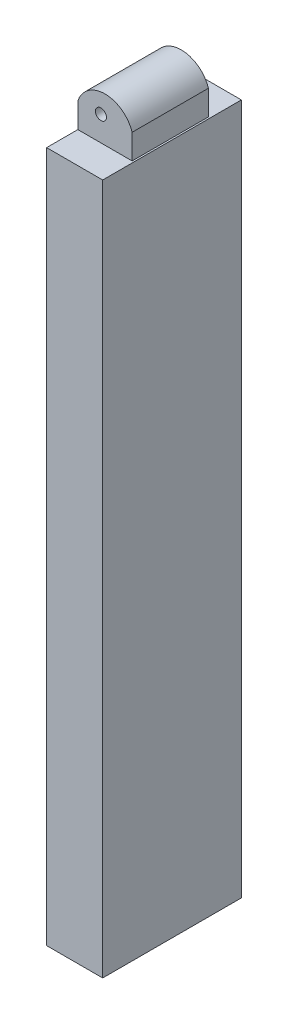
ISO-10303-21;
HEADER;
FILE_DESCRIPTION(('STEP AP214'),'2;1');
FILE_NAME('part.step','',(''),(''),'','','');
FILE_SCHEMA(('AUTOMOTIVE_DESIGN { 1 0 10303 214 1 1 1 1 }'));
ENDSEC;
DATA;
#1=APPLICATION_CONTEXT('core data for automotive mechanical design processes');
#2=APPLICATION_PROTOCOL_DEFINITION('international standard','automotive_design',2000,#1);
#3=PRODUCT_CONTEXT('',#1,'mechanical');
#4=PRODUCT('Part','Part','',(#3));
#5=PRODUCT_RELATED_PRODUCT_CATEGORY('part','',(#4));
#6=PRODUCT_DEFINITION_FORMATION('','',#4);
#7=PRODUCT_DEFINITION_CONTEXT('part definition',#1,'design');
#8=PRODUCT_DEFINITION('design','',#6,#7);
#9=PRODUCT_DEFINITION_SHAPE('','',#8);
#10=(LENGTH_UNIT() NAMED_UNIT(*) SI_UNIT(.MILLI.,.METRE.));
#11=(NAMED_UNIT(*) PLANE_ANGLE_UNIT() SI_UNIT($,.RADIAN.));
#12=(NAMED_UNIT(*) SI_UNIT($,.STERADIAN.) SOLID_ANGLE_UNIT());
#13=UNCERTAINTY_MEASURE_WITH_UNIT(LENGTH_MEASURE(1.E-05),#10,'distance_accuracy_value','');
#14=(GEOMETRIC_REPRESENTATION_CONTEXT(3) GLOBAL_UNCERTAINTY_ASSIGNED_CONTEXT((#13)) GLOBAL_UNIT_ASSIGNED_CONTEXT((#10,
#11,#12)) REPRESENTATION_CONTEXT('',''));
#15=CARTESIAN_POINT('',(0.,0.,0.));
#16=DIRECTION('',(0.,0.,1.));
#17=DIRECTION('',(1.,0.,0.));
#18=AXIS2_PLACEMENT_3D('',#15,#16,#17);
#19=CARTESIAN_POINT('',(9.4,67.8,-6.6));
#20=DIRECTION('',(0.,0.,1.));
#21=DIRECTION('',(1.,0.,0.));
#22=AXIS2_PLACEMENT_3D('',#19,#20,#21);
#23=PLANE('',#22);
#24=DIRECTION('',(0.,-1.,0.));
#25=VECTOR('',#24,1.);
#26=CARTESIAN_POINT('',(0.,67.8,-6.6));
#27=LINE('',#26,#25);
#28=CARTESIAN_POINT('',(0.,64.1,-6.6));
#29=VERTEX_POINT('',#28);
#30=CARTESIAN_POINT('',(0.,59.8,-6.6));
#31=VERTEX_POINT('',#30);
#32=EDGE_CURVE('E139',#29,#31,#27,.T.);
#33=ORIENTED_EDGE('',*,*,#32,.F.);
#34=CARTESIAN_POINT('',(4.7,62.5514705882353,-6.6));
#35=DIRECTION('',(0.,0.,1.));
#36=DIRECTION('',(1.,0.,0.));
#37=AXIS2_PLACEMENT_3D('',#34,#35,#36);
#38=CIRCLE('',#37,4.9485294117647);
#39=CARTESIAN_POINT('',(9.4,64.1,-6.6));
#40=VERTEX_POINT('',#39);
#41=EDGE_CURVE('E130',#29,#40,#38,.F.);
#42=ORIENTED_EDGE('',*,*,#41,.T.);
#43=DIRECTION('',(0.,-1.,0.));
#44=VECTOR('',#43,1.);
#45=CARTESIAN_POINT('',(9.4,67.8,-6.6));
#46=LINE('',#45,#44);
#47=CARTESIAN_POINT('',(9.4,59.8,-6.6));
#48=VERTEX_POINT('',#47);
#49=EDGE_CURVE('E129',#40,#48,#46,.T.);
#50=ORIENTED_EDGE('',*,*,#49,.T.);
#51=DIRECTION('',(-1.,0.,0.));
#52=VECTOR('',#51,1.);
#53=CARTESIAN_POINT('',(9.4,59.8,-6.6));
#54=LINE('',#53,#52);
#55=EDGE_CURVE('E141',#48,#31,#54,.T.);
#56=ORIENTED_EDGE('',*,*,#55,.T.);
#57=EDGE_LOOP('',(#33,#42,#50,#56));
#58=FACE_BOUND('',#57,.T.);
#59=CARTESIAN_POINT('',(4.,64.1,-6.6));
#60=DIRECTION('',(0.,0.,1.));
#61=DIRECTION('',(1.,0.,0.));
#62=AXIS2_PLACEMENT_3D('',#59,#60,#61);
#63=CIRCLE('',#62,0.949999999999999);
#64=CARTESIAN_POINT('',(4.95,64.1,-6.6));
#65=VERTEX_POINT('',#64);
#66=EDGE_CURVE('E232',#65,#65,#63,.T.);
#67=ORIENTED_EDGE('',*,*,#66,.T.);
#68=EDGE_LOOP('',(#67));
#69=FACE_BOUND('',#68,.T.);
#70=ADVANCED_FACE('F54',(#58,#69),#23,.F.);
#71=CARTESIAN_POINT('',(9.4,67.8,6.6));
#72=DIRECTION('',(0.,0.,-1.));
#73=DIRECTION('',(-1.,0.,0.));
#74=AXIS2_PLACEMENT_3D('',#71,#72,#73);
#75=PLANE('',#74);
#76=DIRECTION('',(0.,-1.,0.));
#77=VECTOR('',#76,1.);
#78=CARTESIAN_POINT('',(9.4,67.8,6.6));
#79=LINE('',#78,#77);
#80=CARTESIAN_POINT('',(9.4,64.1,6.6));
#81=VERTEX_POINT('',#80);
#82=CARTESIAN_POINT('',(9.4,59.8,6.6));
#83=VERTEX_POINT('',#82);
#84=EDGE_CURVE('E79',#81,#83,#79,.T.);
#85=ORIENTED_EDGE('',*,*,#84,.F.);
#86=CARTESIAN_POINT('',(4.7,62.5514705882353,6.6));
#87=DIRECTION('',(0.,0.,1.));
#88=DIRECTION('',(1.,0.,0.));
#89=AXIS2_PLACEMENT_3D('',#86,#87,#88);
#90=CIRCLE('',#89,4.9485294117647);
#91=CARTESIAN_POINT('',(0.,64.1,6.6));
#92=VERTEX_POINT('',#91);
#93=EDGE_CURVE('E119',#92,#81,#90,.F.);
#94=ORIENTED_EDGE('',*,*,#93,.F.);
#95=DIRECTION('',(0.,-1.,0.));
#96=VECTOR('',#95,1.);
#97=CARTESIAN_POINT('',(0.,67.8,6.6));
#98=LINE('',#97,#96);
#99=CARTESIAN_POINT('',(0.,59.8,6.6));
#100=VERTEX_POINT('',#99);
#101=EDGE_CURVE('E137',#92,#100,#98,.T.);
#102=ORIENTED_EDGE('',*,*,#101,.T.);
#103=DIRECTION('',(1.,0.,0.));
#104=VECTOR('',#103,1.);
#105=CARTESIAN_POINT('',(9.4,59.8,6.6));
#106=LINE('',#105,#104);
#107=EDGE_CURVE('E136',#100,#83,#106,.T.);
#108=ORIENTED_EDGE('',*,*,#107,.T.);
#109=EDGE_LOOP('',(#85,#94,#102,#108));
#110=FACE_BOUND('',#109,.T.);
#111=CARTESIAN_POINT('',(4.,64.1,6.6));
#112=DIRECTION('',(0.,0.,1.));
#113=DIRECTION('',(1.,0.,0.));
#114=AXIS2_PLACEMENT_3D('',#111,#112,#113);
#115=CIRCLE('',#114,0.949999999999999);
#116=CARTESIAN_POINT('',(4.95,64.1,6.6));
#117=VERTEX_POINT('',#116);
#118=EDGE_CURVE('E125',#117,#117,#115,.T.);
#119=ORIENTED_EDGE('',*,*,#118,.F.);
#120=EDGE_LOOP('',(#119));
#121=FACE_BOUND('',#120,.T.);
#122=ADVANCED_FACE('F133',(#110,#121),#75,.F.);
#123=CARTESIAN_POINT('',(9.7,59.8,-12.));
#124=DIRECTION('',(0.,-1.,0.));
#125=DIRECTION('',(0.,0.,-1.));
#126=AXIS2_PLACEMENT_3D('',#123,#124,#125);
#127=PLANE('',#126);
#128=ORIENTED_EDGE('',*,*,#107,.F.);
#129=DIRECTION('',(0.,0.,1.));
#130=VECTOR('',#129,1.);
#131=CARTESIAN_POINT('',(0.,59.8,-12.));
#132=LINE('',#131,#130);
#133=CARTESIAN_POINT('',(0.,59.8,12.));
#134=VERTEX_POINT('',#133);
#135=EDGE_CURVE('E164',#100,#134,#132,.T.);
#136=ORIENTED_EDGE('',*,*,#135,.T.);
#137=DIRECTION('',(-1.,0.,0.));
#138=VECTOR('',#137,1.);
#139=CARTESIAN_POINT('',(9.7,59.8,12.));
#140=LINE('',#139,#138);
#141=CARTESIAN_POINT('',(9.7,59.8,12.));
#142=VERTEX_POINT('',#141);
#143=EDGE_CURVE('E170',#142,#134,#140,.T.);
#144=ORIENTED_EDGE('',*,*,#143,.F.);
#145=DIRECTION('',(0.,0.,1.));
#146=VECTOR('',#145,1.);
#147=CARTESIAN_POINT('',(9.7,59.8,-12.));
#148=LINE('',#147,#146);
#149=CARTESIAN_POINT('',(9.7,59.8,-12.));
#150=VERTEX_POINT('',#149);
#151=EDGE_CURVE('E155',#150,#142,#148,.T.);
#152=ORIENTED_EDGE('',*,*,#151,.F.);
#153=DIRECTION('',(-1.,0.,0.));
#154=VECTOR('',#153,1.);
#155=CARTESIAN_POINT('',(9.7,59.8,-12.));
#156=LINE('',#155,#154);
#157=CARTESIAN_POINT('',(0.,59.8,-12.));
#158=VERTEX_POINT('',#157);
#159=EDGE_CURVE('E63',#150,#158,#156,.T.);
#160=ORIENTED_EDGE('',*,*,#159,.T.);
#161=EDGE_CURVE('E165',#158,#31,#132,.T.);
#162=ORIENTED_EDGE('',*,*,#161,.T.);
#163=ORIENTED_EDGE('',*,*,#55,.F.);
#164=DIRECTION('',(0.,0.,-1.));
#165=VECTOR('',#164,1.);
#166=CARTESIAN_POINT('',(9.4,59.8,6.6));
#167=LINE('',#166,#165);
#168=EDGE_CURVE('E233',#83,#48,#167,.T.);
#169=ORIENTED_EDGE('',*,*,#168,.F.);
#170=EDGE_LOOP('',(#128,#136,#144,#152,#160,#162,#163,#169));
#171=FACE_BOUND('',#170,.T.);
#172=ADVANCED_FACE('F191',(#171),#127,.F.);
#173=CARTESIAN_POINT('',(9.7,-59.8,-12.));
#174=DIRECTION('',(0.,-1.,0.));
#175=DIRECTION('',(0.,0.,-1.));
#176=AXIS2_PLACEMENT_3D('',#173,#174,#175);
#177=PLANE('',#176);
#178=DIRECTION('',(0.,0.,1.));
#179=VECTOR('',#178,1.);
#180=CARTESIAN_POINT('',(0.,-59.8,-12.));
#181=LINE('',#180,#179);
#182=CARTESIAN_POINT('',(0.,-59.8,-12.));
#183=VERTEX_POINT('',#182);
#184=CARTESIAN_POINT('',(0.,-59.8,12.));
#185=VERTEX_POINT('',#184);
#186=EDGE_CURVE('E147',#183,#185,#181,.T.);
#187=ORIENTED_EDGE('',*,*,#186,.F.);
#188=DIRECTION('',(-1.,0.,0.));
#189=VECTOR('',#188,1.);
#190=CARTESIAN_POINT('',(9.7,-59.8,-12.));
#191=LINE('',#190,#189);
#192=CARTESIAN_POINT('',(9.7,-59.8,-12.));
#193=VERTEX_POINT('',#192);
#194=EDGE_CURVE('E12',#193,#183,#191,.T.);
#195=ORIENTED_EDGE('',*,*,#194,.F.);
#196=DIRECTION('',(0.,0.,1.));
#197=VECTOR('',#196,1.);
#198=CARTESIAN_POINT('',(9.7,-59.8,-12.));
#199=LINE('',#198,#197);
#200=CARTESIAN_POINT('',(9.7,-59.8,12.));
#201=VERTEX_POINT('',#200);
#202=EDGE_CURVE('E148',#193,#201,#199,.T.);
#203=ORIENTED_EDGE('',*,*,#202,.T.);
#204=DIRECTION('',(-1.,0.,0.));
#205=VECTOR('',#204,1.);
#206=CARTESIAN_POINT('',(9.7,-59.8,12.));
#207=LINE('',#206,#205);
#208=EDGE_CURVE('E58',#201,#185,#207,.T.);
#209=ORIENTED_EDGE('',*,*,#208,.T.);
#210=EDGE_LOOP('',(#187,#195,#203,#209));
#211=FACE_BOUND('',#210,.T.);
#212=ADVANCED_FACE('F56',(#211),#177,.T.);
#213=CARTESIAN_POINT('',(9.7,-59.8,-12.));
#214=DIRECTION('',(0.,0.,1.));
#215=DIRECTION('',(1.,0.,0.));
#216=AXIS2_PLACEMENT_3D('',#213,#214,#215);
#217=PLANE('',#216);
#218=DIRECTION('',(0.,1.,0.));
#219=VECTOR('',#218,1.);
#220=CARTESIAN_POINT('',(0.,-59.8,-12.));
#221=LINE('',#220,#219);
#222=EDGE_CURVE('E152',#183,#158,#221,.T.);
#223=ORIENTED_EDGE('',*,*,#222,.T.);
#224=ORIENTED_EDGE('',*,*,#159,.F.);
#225=DIRECTION('',(0.,1.,0.));
#226=VECTOR('',#225,1.);
#227=CARTESIAN_POINT('',(9.7,-59.8,-12.));
#228=LINE('',#227,#226);
#229=EDGE_CURVE('E157',#193,#150,#228,.T.);
#230=ORIENTED_EDGE('',*,*,#229,.F.);
#231=ORIENTED_EDGE('',*,*,#194,.T.);
#232=EDGE_LOOP('',(#223,#224,#230,#231));
#233=FACE_BOUND('',#232,.T.);
#234=ADVANCED_FACE('F187',(#233),#217,.F.);
#235=CARTESIAN_POINT('',(9.7,-59.8,12.));
#236=DIRECTION('',(0.,0.,1.));
#237=DIRECTION('',(1.,0.,0.));
#238=AXIS2_PLACEMENT_3D('',#235,#236,#237);
#239=PLANE('',#238);
#240=DIRECTION('',(0.,1.,0.));
#241=VECTOR('',#240,1.);
#242=CARTESIAN_POINT('',(0.,-59.8,12.));
#243=LINE('',#242,#241);
#244=EDGE_CURVE('E161',#185,#134,#243,.T.);
#245=ORIENTED_EDGE('',*,*,#244,.F.);
#246=ORIENTED_EDGE('',*,*,#208,.F.);
#247=DIRECTION('',(0.,1.,0.));
#248=VECTOR('',#247,1.);
#249=CARTESIAN_POINT('',(9.7,-59.8,12.));
#250=LINE('',#249,#248);
#251=EDGE_CURVE('E151',#201,#142,#250,.T.);
#252=ORIENTED_EDGE('',*,*,#251,.T.);
#253=ORIENTED_EDGE('',*,*,#143,.T.);
#254=EDGE_LOOP('',(#245,#246,#252,#253));
#255=FACE_BOUND('',#254,.T.);
#256=ADVANCED_FACE('F179',(#255),#239,.T.);
#257=CARTESIAN_POINT('',(9.7,0.,0.));
#258=DIRECTION('',(-1.,0.,0.));
#259=DIRECTION('',(0.,0.,1.));
#260=AXIS2_PLACEMENT_3D('',#257,#258,#259);
#261=PLANE('',#260);
#262=ORIENTED_EDGE('',*,*,#202,.F.);
#263=ORIENTED_EDGE('',*,*,#229,.T.);
#264=ORIENTED_EDGE('',*,*,#151,.T.);
#265=ORIENTED_EDGE('',*,*,#251,.F.);
#266=EDGE_LOOP('',(#262,#263,#264,#265));
#267=FACE_BOUND('',#266,.T.);
#268=ADVANCED_FACE('F195',(#267),#261,.F.);
#269=CARTESIAN_POINT('',(0.,0.,0.));
#270=DIRECTION('',(-1.,0.,0.));
#271=DIRECTION('',(0.,0.,1.));
#272=AXIS2_PLACEMENT_3D('',#269,#270,#271);
#273=PLANE('',#272);
#274=DIRECTION('',(0.,0.,1.));
#275=VECTOR('',#274,1.);
#276=CARTESIAN_POINT('',(0.,64.1,-12.));
#277=LINE('',#276,#275);
#278=EDGE_CURVE('E71',#29,#92,#277,.T.);
#279=ORIENTED_EDGE('',*,*,#278,.F.);
#280=ORIENTED_EDGE('',*,*,#32,.T.);
#281=ORIENTED_EDGE('',*,*,#161,.F.);
#282=ORIENTED_EDGE('',*,*,#222,.F.);
#283=ORIENTED_EDGE('',*,*,#186,.T.);
#284=ORIENTED_EDGE('',*,*,#244,.T.);
#285=ORIENTED_EDGE('',*,*,#135,.F.);
#286=ORIENTED_EDGE('',*,*,#101,.F.);
#287=EDGE_LOOP('',(#279,#280,#281,#282,#283,#284,#285,#286));
#288=FACE_BOUND('',#287,.T.);
#289=ADVANCED_FACE('F183',(#288),#273,.T.);
#290=CARTESIAN_POINT('',(9.4,67.8,6.6));
#291=DIRECTION('',(-1.,0.,0.));
#292=DIRECTION('',(0.,0.,1.));
#293=AXIS2_PLACEMENT_3D('',#290,#291,#292);
#294=PLANE('',#293);
#295=ORIENTED_EDGE('',*,*,#49,.F.);
#296=DIRECTION('',(0.,0.,1.));
#297=VECTOR('',#296,1.);
#298=CARTESIAN_POINT('',(9.4,64.1,-12.));
#299=LINE('',#298,#297);
#300=EDGE_CURVE('E121',#40,#81,#299,.T.);
#301=ORIENTED_EDGE('',*,*,#300,.T.);
#302=ORIENTED_EDGE('',*,*,#84,.T.);
#303=ORIENTED_EDGE('',*,*,#168,.T.);
#304=EDGE_LOOP('',(#295,#301,#302,#303));
#305=FACE_BOUND('',#304,.T.);
#306=ADVANCED_FACE('F128',(#305),#294,.F.);
#307=CARTESIAN_POINT('',(4.7,62.5514705882353,-12.));
#308=DIRECTION('',(0.,0.,1.));
#309=DIRECTION('',(1.,0.,0.));
#310=AXIS2_PLACEMENT_3D('',#307,#308,#309);
#311=CYLINDRICAL_SURFACE('',#310,4.9485294117647);
#312=ORIENTED_EDGE('',*,*,#278,.T.);
#313=ORIENTED_EDGE('',*,*,#93,.T.);
#314=ORIENTED_EDGE('',*,*,#300,.F.);
#315=ORIENTED_EDGE('',*,*,#41,.F.);
#316=EDGE_LOOP('',(#312,#313,#314,#315));
#317=FACE_BOUND('',#316,.T.);
#318=ADVANCED_FACE('F120',(#317),#311,.T.);
#319=CARTESIAN_POINT('',(4.,64.1,-12.));
#320=DIRECTION('',(0.,0.,1.));
#321=DIRECTION('',(1.,0.,0.));
#322=AXIS2_PLACEMENT_3D('',#319,#320,#321);
#323=CYLINDRICAL_SURFACE('',#322,0.949999999999999);
#324=ORIENTED_EDGE('',*,*,#118,.T.);
#325=EDGE_LOOP('',(#324));
#326=FACE_BOUND('',#325,.T.);
#327=ORIENTED_EDGE('',*,*,#66,.F.);
#328=EDGE_LOOP('',(#327));
#329=FACE_BOUND('',#328,.T.);
#330=ADVANCED_FACE('F219',(#326,#329),#323,.F.);
#331=CLOSED_SHELL('',(#70,#122,#172,#212,#234,#256,#268,#289,#306,#318,#330));
#332=MANIFOLD_SOLID_BREP('B2',#331);
#333=ADVANCED_BREP_SHAPE_REPRESENTATION('',(#18,#332),#14);
#334=SHAPE_DEFINITION_REPRESENTATION(#9,#333);
ENDSEC;
END-ISO-10303-21;
